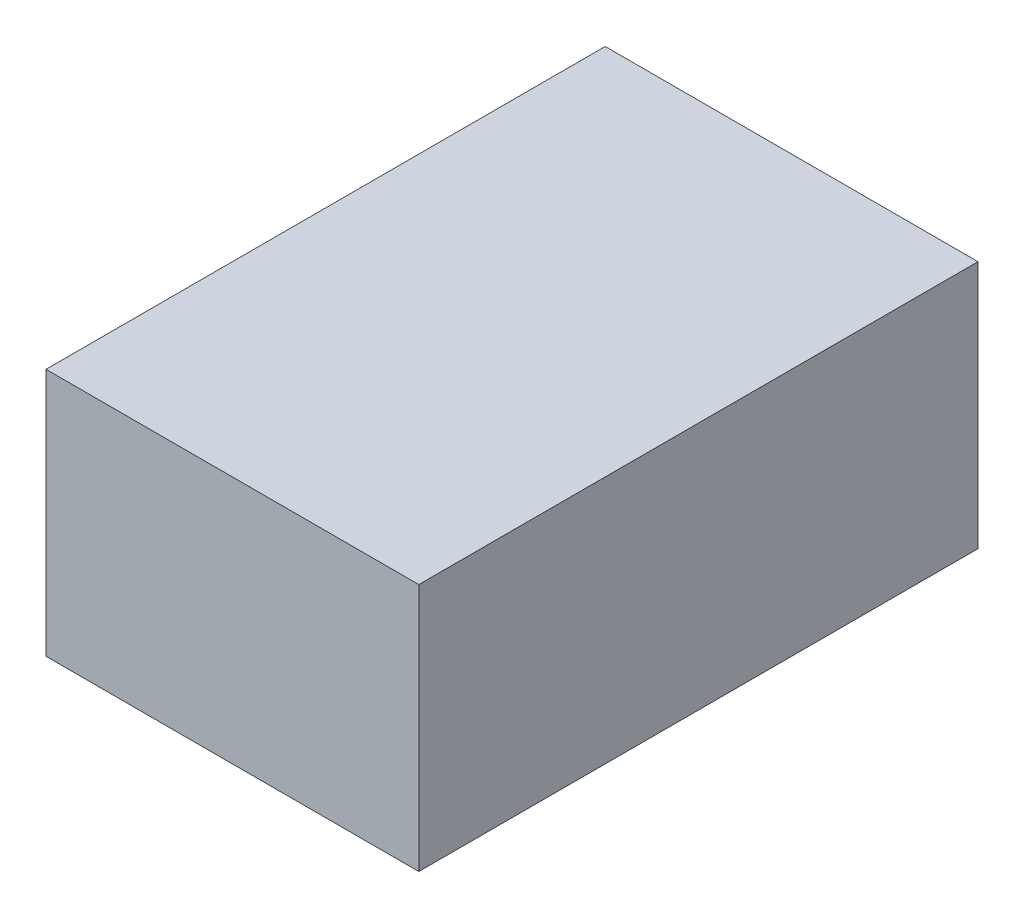
ISO-10303-21;
HEADER;
FILE_DESCRIPTION(('STEP AP214'),'2;1');
FILE_NAME('part.step','',(''),(''),'','','');
FILE_SCHEMA(('AUTOMOTIVE_DESIGN { 1 0 10303 214 1 1 1 1 }'));
ENDSEC;
DATA;
#1=APPLICATION_CONTEXT('core data for automotive mechanical design processes');
#2=APPLICATION_PROTOCOL_DEFINITION('international standard','automotive_design',2000,#1);
#3=PRODUCT_CONTEXT('',#1,'mechanical');
#4=PRODUCT('Part','Part','',(#3));
#5=PRODUCT_RELATED_PRODUCT_CATEGORY('part','',(#4));
#6=PRODUCT_DEFINITION_FORMATION('','',#4);
#7=PRODUCT_DEFINITION_CONTEXT('part definition',#1,'design');
#8=PRODUCT_DEFINITION('design','',#6,#7);
#9=PRODUCT_DEFINITION_SHAPE('','',#8);
#10=(LENGTH_UNIT() NAMED_UNIT(*) SI_UNIT(.MILLI.,.METRE.));
#11=(NAMED_UNIT(*) PLANE_ANGLE_UNIT() SI_UNIT($,.RADIAN.));
#12=(NAMED_UNIT(*) SI_UNIT($,.STERADIAN.) SOLID_ANGLE_UNIT());
#13=UNCERTAINTY_MEASURE_WITH_UNIT(LENGTH_MEASURE(1.E-05),#10,'distance_accuracy_value','');
#14=(GEOMETRIC_REPRESENTATION_CONTEXT(3) GLOBAL_UNCERTAINTY_ASSIGNED_CONTEXT((#13)) GLOBAL_UNIT_ASSIGNED_CONTEXT((#10,
#11,#12)) REPRESENTATION_CONTEXT('',''));
#15=CARTESIAN_POINT('',(0.,0.,0.));
#16=DIRECTION('',(0.,0.,1.));
#17=DIRECTION('',(1.,0.,0.));
#18=AXIS2_PLACEMENT_3D('',#15,#16,#17);
#19=CARTESIAN_POINT('',(15.,10.,-22.5));
#20=DIRECTION('',(-1.,0.,0.));
#21=DIRECTION('',(0.,0.,1.));
#22=AXIS2_PLACEMENT_3D('',#19,#20,#21);
#23=PLANE('',#22);
#24=DIRECTION('',(0.,0.,-1.));
#25=VECTOR('',#24,1.);
#26=CARTESIAN_POINT('',(15.,-10.,-22.5));
#27=LINE('',#26,#25);
#28=CARTESIAN_POINT('',(15.,-10.,22.5));
#29=VERTEX_POINT('',#28);
#30=CARTESIAN_POINT('',(15.,-10.,-22.5));
#31=VERTEX_POINT('',#30);
#32=EDGE_CURVE('E107',#29,#31,#27,.T.);
#33=ORIENTED_EDGE('',*,*,#32,.T.);
#34=DIRECTION('',(0.,-1.,0.));
#35=VECTOR('',#34,1.);
#36=CARTESIAN_POINT('',(15.,10.,-22.5));
#37=LINE('',#36,#35);
#38=CARTESIAN_POINT('',(15.,10.,-22.5));
#39=VERTEX_POINT('',#38);
#40=EDGE_CURVE('E11',#39,#31,#37,.T.);
#41=ORIENTED_EDGE('',*,*,#40,.F.);
#42=DIRECTION('',(0.,0.,-1.));
#43=VECTOR('',#42,1.);
#44=CARTESIAN_POINT('',(15.,10.,-22.5));
#45=LINE('',#44,#43);
#46=CARTESIAN_POINT('',(15.,10.,22.5));
#47=VERTEX_POINT('',#46);
#48=EDGE_CURVE('E91',#47,#39,#45,.T.);
#49=ORIENTED_EDGE('',*,*,#48,.F.);
#50=DIRECTION('',(0.,-1.,0.));
#51=VECTOR('',#50,1.);
#52=CARTESIAN_POINT('',(15.,10.,22.5));
#53=LINE('',#52,#51);
#54=EDGE_CURVE('E103',#47,#29,#53,.T.);
#55=ORIENTED_EDGE('',*,*,#54,.T.);
#56=EDGE_LOOP('',(#33,#41,#49,#55));
#57=FACE_BOUND('',#56,.T.);
#58=ADVANCED_FACE('F39',(#57),#23,.F.);
#59=CARTESIAN_POINT('',(-15.,10.,-22.5));
#60=DIRECTION('',(0.,0.,1.));
#61=DIRECTION('',(1.,0.,0.));
#62=AXIS2_PLACEMENT_3D('',#59,#60,#61);
#63=PLANE('',#62);
#64=DIRECTION('',(-1.,0.,0.));
#65=VECTOR('',#64,1.);
#66=CARTESIAN_POINT('',(-15.,-10.,-22.5));
#67=LINE('',#66,#65);
#68=CARTESIAN_POINT('',(-15.,-10.,-22.5));
#69=VERTEX_POINT('',#68);
#70=EDGE_CURVE('E96',#31,#69,#67,.T.);
#71=ORIENTED_EDGE('',*,*,#70,.T.);
#72=DIRECTION('',(0.,-1.,0.));
#73=VECTOR('',#72,1.);
#74=CARTESIAN_POINT('',(-15.,10.,-22.5));
#75=LINE('',#74,#73);
#76=CARTESIAN_POINT('',(-15.,10.,-22.5));
#77=VERTEX_POINT('',#76);
#78=EDGE_CURVE('E48',#77,#69,#75,.T.);
#79=ORIENTED_EDGE('',*,*,#78,.F.);
#80=DIRECTION('',(-1.,0.,0.));
#81=VECTOR('',#80,1.);
#82=CARTESIAN_POINT('',(-15.,10.,-22.5));
#83=LINE('',#82,#81);
#84=EDGE_CURVE('E86',#39,#77,#83,.T.);
#85=ORIENTED_EDGE('',*,*,#84,.F.);
#86=ORIENTED_EDGE('',*,*,#40,.T.);
#87=EDGE_LOOP('',(#71,#79,#85,#86));
#88=FACE_BOUND('',#87,.T.);
#89=ADVANCED_FACE('F95',(#88),#63,.F.);
#90=CARTESIAN_POINT('',(-15.,10.,-22.5));
#91=DIRECTION('',(1.,0.,0.));
#92=DIRECTION('',(0.,0.,-1.));
#93=AXIS2_PLACEMENT_3D('',#90,#91,#92);
#94=PLANE('',#93);
#95=DIRECTION('',(0.,0.,1.));
#96=VECTOR('',#95,1.);
#97=CARTESIAN_POINT('',(-15.,-10.,-22.5));
#98=LINE('',#97,#96);
#99=CARTESIAN_POINT('',(-15.,-10.,22.5));
#100=VERTEX_POINT('',#99);
#101=EDGE_CURVE('E73',#69,#100,#98,.T.);
#102=ORIENTED_EDGE('',*,*,#101,.T.);
#103=DIRECTION('',(0.,-1.,0.));
#104=VECTOR('',#103,1.);
#105=CARTESIAN_POINT('',(-15.,10.,22.5));
#106=LINE('',#105,#104);
#107=CARTESIAN_POINT('',(-15.,10.,22.5));
#108=VERTEX_POINT('',#107);
#109=EDGE_CURVE('E98',#108,#100,#106,.T.);
#110=ORIENTED_EDGE('',*,*,#109,.F.);
#111=DIRECTION('',(0.,0.,1.));
#112=VECTOR('',#111,1.);
#113=CARTESIAN_POINT('',(-15.,10.,-22.5));
#114=LINE('',#113,#112);
#115=EDGE_CURVE('E89',#77,#108,#114,.T.);
#116=ORIENTED_EDGE('',*,*,#115,.F.);
#117=ORIENTED_EDGE('',*,*,#78,.T.);
#118=EDGE_LOOP('',(#102,#110,#116,#117));
#119=FACE_BOUND('',#118,.T.);
#120=ADVANCED_FACE('F99',(#119),#94,.F.);
#121=CARTESIAN_POINT('',(-15.,10.,22.5));
#122=DIRECTION('',(0.,0.,-1.));
#123=DIRECTION('',(-1.,0.,0.));
#124=AXIS2_PLACEMENT_3D('',#121,#122,#123);
#125=PLANE('',#124);
#126=DIRECTION('',(1.,0.,0.));
#127=VECTOR('',#126,1.);
#128=CARTESIAN_POINT('',(-15.,-10.,22.5));
#129=LINE('',#128,#127);
#130=EDGE_CURVE('E79',#100,#29,#129,.T.);
#131=ORIENTED_EDGE('',*,*,#130,.T.);
#132=ORIENTED_EDGE('',*,*,#54,.F.);
#133=DIRECTION('',(1.,0.,0.));
#134=VECTOR('',#133,1.);
#135=CARTESIAN_POINT('',(-15.,10.,22.5));
#136=LINE('',#135,#134);
#137=EDGE_CURVE('E56',#108,#47,#136,.T.);
#138=ORIENTED_EDGE('',*,*,#137,.F.);
#139=ORIENTED_EDGE('',*,*,#109,.T.);
#140=EDGE_LOOP('',(#131,#132,#138,#139));
#141=FACE_BOUND('',#140,.T.);
#142=ADVANCED_FACE('F120',(#141),#125,.F.);
#143=CARTESIAN_POINT('',(0.,10.,0.));
#144=DIRECTION('',(0.,1.,0.));
#145=DIRECTION('',(0.,0.,1.));
#146=AXIS2_PLACEMENT_3D('',#143,#144,#145);
#147=PLANE('',#146);
#148=ORIENTED_EDGE('',*,*,#48,.T.);
#149=ORIENTED_EDGE('',*,*,#84,.T.);
#150=ORIENTED_EDGE('',*,*,#115,.T.);
#151=ORIENTED_EDGE('',*,*,#137,.T.);
#152=EDGE_LOOP('',(#148,#149,#150,#151));
#153=FACE_BOUND('',#152,.T.);
#154=ADVANCED_FACE('F87',(#153),#147,.T.);
#155=CARTESIAN_POINT('',(0.,-10.,0.));
#156=DIRECTION('',(0.,1.,0.));
#157=DIRECTION('',(0.,0.,1.));
#158=AXIS2_PLACEMENT_3D('',#155,#156,#157);
#159=PLANE('',#158);
#160=ORIENTED_EDGE('',*,*,#32,.F.);
#161=ORIENTED_EDGE('',*,*,#130,.F.);
#162=ORIENTED_EDGE('',*,*,#101,.F.);
#163=ORIENTED_EDGE('',*,*,#70,.F.);
#164=EDGE_LOOP('',(#160,#161,#162,#163));
#165=FACE_BOUND('',#164,.T.);
#166=ADVANCED_FACE('F123',(#165),#159,.F.);
#167=CLOSED_SHELL('',(#58,#89,#120,#142,#154,#166));
#168=MANIFOLD_SOLID_BREP('B2',#167);
#169=ADVANCED_BREP_SHAPE_REPRESENTATION('',(#18,#168),#14);
#170=SHAPE_DEFINITION_REPRESENTATION(#9,#169);
ENDSEC;
END-ISO-10303-21;
